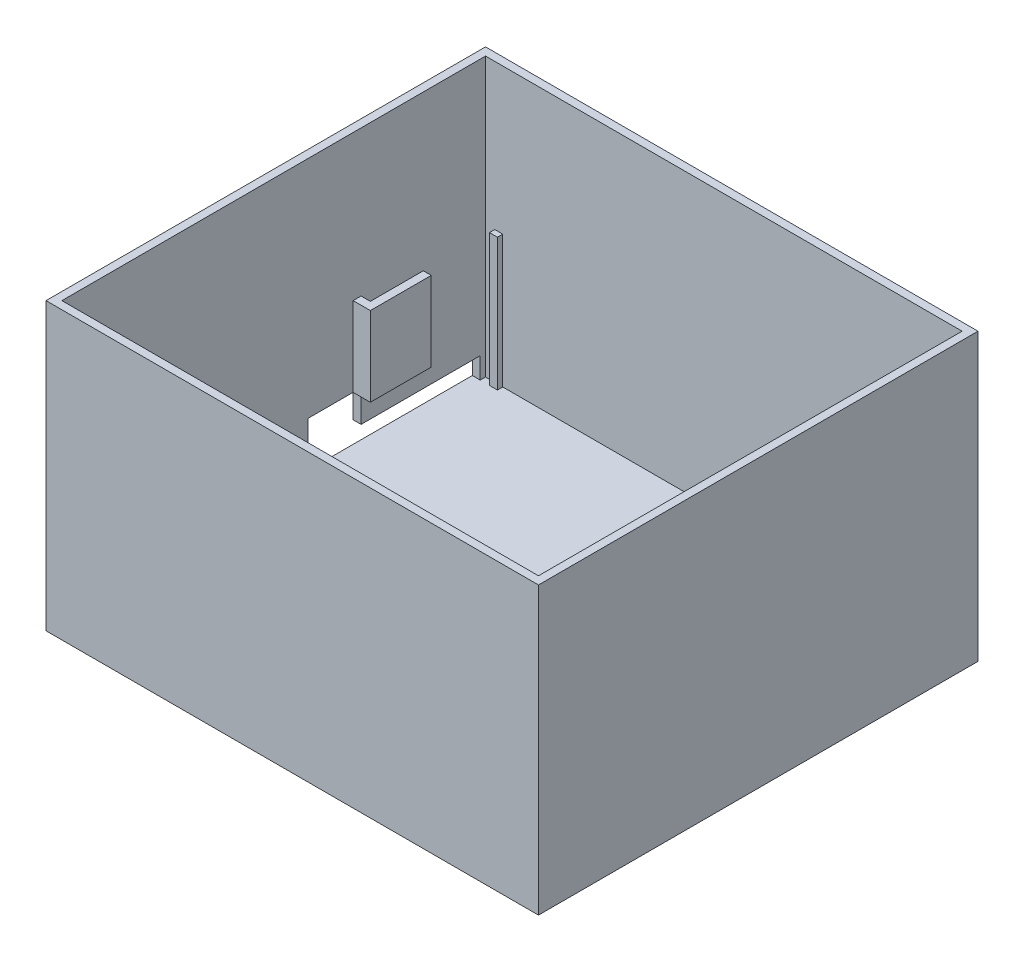
ISO-10303-21;
HEADER;
FILE_DESCRIPTION(('STEP AP214'),'2;1');
FILE_NAME('part.step','',(''),(''),'','','');
FILE_SCHEMA(('AUTOMOTIVE_DESIGN { 1 0 10303 214 1 1 1 1 }'));
ENDSEC;
DATA;
#1=APPLICATION_CONTEXT('core data for automotive mechanical design processes');
#2=APPLICATION_PROTOCOL_DEFINITION('international standard','automotive_design',2000,#1);
#3=PRODUCT_CONTEXT('',#1,'mechanical');
#4=PRODUCT('Part','Part','',(#3));
#5=PRODUCT_RELATED_PRODUCT_CATEGORY('part','',(#4));
#6=PRODUCT_DEFINITION_FORMATION('','',#4);
#7=PRODUCT_DEFINITION_CONTEXT('part definition',#1,'design');
#8=PRODUCT_DEFINITION('design','',#6,#7);
#9=PRODUCT_DEFINITION_SHAPE('','',#8);
#10=(LENGTH_UNIT() NAMED_UNIT(*) SI_UNIT(.MILLI.,.METRE.));
#11=(NAMED_UNIT(*) PLANE_ANGLE_UNIT() SI_UNIT($,.RADIAN.));
#12=(NAMED_UNIT(*) SI_UNIT($,.STERADIAN.) SOLID_ANGLE_UNIT());
#13=UNCERTAINTY_MEASURE_WITH_UNIT(LENGTH_MEASURE(1.E-05),#10,'distance_accuracy_value','');
#14=(GEOMETRIC_REPRESENTATION_CONTEXT(3) GLOBAL_UNCERTAINTY_ASSIGNED_CONTEXT((#13)) GLOBAL_UNIT_ASSIGNED_CONTEXT((#10,
#11,#12)) REPRESENTATION_CONTEXT('',''));
#15=CARTESIAN_POINT('',(0.,0.,0.));
#16=DIRECTION('',(0.,0.,1.));
#17=DIRECTION('',(1.,0.,0.));
#18=AXIS2_PLACEMENT_3D('',#15,#16,#17);
#19=CARTESIAN_POINT('',(-79.75,23.,-2.875));
#20=DIRECTION('',(0.,0.,1.));
#21=DIRECTION('',(1.,0.,0.));
#22=AXIS2_PLACEMENT_3D('',#19,#20,#21);
#23=PLANE('',#22);
#24=DIRECTION('',(0.,1.,0.));
#25=VECTOR('',#24,1.);
#26=CARTESIAN_POINT('',(-82.75,23.,-2.875));
#27=LINE('',#26,#25);
#28=CARTESIAN_POINT('',(-82.75,23.,-2.875));
#29=VERTEX_POINT('',#28);
#30=CARTESIAN_POINT('',(-82.75,53.,-2.875));
#31=VERTEX_POINT('',#30);
#32=EDGE_CURVE('E242',#29,#31,#27,.T.);
#33=ORIENTED_EDGE('',*,*,#32,.F.);
#34=DIRECTION('',(-1.,0.,0.));
#35=VECTOR('',#34,1.);
#36=CARTESIAN_POINT('',(-79.75,23.,-2.875));
#37=LINE('',#36,#35);
#38=CARTESIAN_POINT('',(-86.25,23.,-2.875));
#39=VERTEX_POINT('',#38);
#40=EDGE_CURVE('E265',#29,#39,#37,.T.);
#41=ORIENTED_EDGE('',*,*,#40,.T.);
#42=DIRECTION('',(0.,1.,0.));
#43=VECTOR('',#42,1.);
#44=CARTESIAN_POINT('',(-86.25,23.,-2.875));
#45=LINE('',#44,#43);
#46=CARTESIAN_POINT('',(-86.25,53.,-2.875));
#47=VERTEX_POINT('',#46);
#48=EDGE_CURVE('E247',#39,#47,#45,.T.);
#49=ORIENTED_EDGE('',*,*,#48,.T.);
#50=DIRECTION('',(-1.,0.,0.));
#51=VECTOR('',#50,1.);
#52=CARTESIAN_POINT('',(-79.75,53.,-2.875));
#53=LINE('',#52,#51);
#54=EDGE_CURVE('E55',#31,#47,#53,.T.);
#55=ORIENTED_EDGE('',*,*,#54,.F.);
#56=EDGE_LOOP('',(#33,#41,#49,#55));
#57=FACE_BOUND('',#56,.T.);
#58=ADVANCED_FACE('F39',(#57),#23,.F.);
#59=CARTESIAN_POINT('',(-86.25,108.,-49.875));
#60=DIRECTION('',(-1.,0.,0.));
#61=DIRECTION('',(0.,0.,1.));
#62=AXIS2_PLACEMENT_3D('',#59,#60,#61);
#63=PLANE('',#62);
#64=ORIENTED_EDGE('',*,*,#48,.F.);
#65=DIRECTION('',(0.,-1.,0.));
#66=VECTOR('',#65,1.);
#67=CARTESIAN_POINT('',(-86.25,2.99999999999999,-2.875));
#68=LINE('',#67,#66);
#69=CARTESIAN_POINT('',(-86.25,11.,-2.875));
#70=VERTEX_POINT('',#69);
#71=EDGE_CURVE('E284',#39,#70,#68,.T.);
#72=ORIENTED_EDGE('',*,*,#71,.T.);
#73=DIRECTION('',(0.,0.,1.));
#74=VECTOR('',#73,1.);
#75=CARTESIAN_POINT('',(-86.25,11.,-47.875));
#76=LINE('',#75,#74);
#77=CARTESIAN_POINT('',(-86.25,11.,-47.875));
#78=VERTEX_POINT('',#77);
#79=EDGE_CURVE('E359',#78,#70,#76,.T.);
#80=ORIENTED_EDGE('',*,*,#79,.F.);
#81=DIRECTION('',(0.,1.,0.));
#82=VECTOR('',#81,1.);
#83=CARTESIAN_POINT('',(-86.25,3.,-47.875));
#84=LINE('',#83,#82);
#85=CARTESIAN_POINT('',(-86.25,3.,-47.875));
#86=VERTEX_POINT('',#85);
#87=EDGE_CURVE('E353',#86,#78,#84,.T.);
#88=ORIENTED_EDGE('',*,*,#87,.F.);
#89=DIRECTION('',(0.,0.,-1.));
#90=VECTOR('',#89,1.);
#91=CARTESIAN_POINT('',(-86.25,3.,-49.875));
#92=LINE('',#91,#90);
#93=CARTESIAN_POINT('',(-86.25,3.,-49.875));
#94=VERTEX_POINT('',#93);
#95=EDGE_CURVE('E416',#86,#94,#92,.T.);
#96=ORIENTED_EDGE('',*,*,#95,.T.);
#97=DIRECTION('',(0.,-1.,0.));
#98=VECTOR('',#97,1.);
#99=CARTESIAN_POINT('',(-86.25,108.,-49.875));
#100=LINE('',#99,#98);
#101=CARTESIAN_POINT('',(-86.25,108.,-49.875));
#102=VERTEX_POINT('',#101);
#103=EDGE_CURVE('E421',#102,#94,#100,.T.);
#104=ORIENTED_EDGE('',*,*,#103,.F.);
#105=DIRECTION('',(0.,0.,-1.));
#106=VECTOR('',#105,1.);
#107=CARTESIAN_POINT('',(-86.25,108.,-49.875));
#108=LINE('',#107,#106);
#109=CARTESIAN_POINT('',(-86.25,108.,110.125));
#110=VERTEX_POINT('',#109);
#111=EDGE_CURVE('E417',#110,#102,#108,.T.);
#112=ORIENTED_EDGE('',*,*,#111,.F.);
#113=DIRECTION('',(0.,-1.,0.));
#114=VECTOR('',#113,1.);
#115=CARTESIAN_POINT('',(-86.25,108.,110.125));
#116=LINE('',#115,#114);
#117=CARTESIAN_POINT('',(-86.25,3.,110.125));
#118=VERTEX_POINT('',#117);
#119=EDGE_CURVE('E430',#110,#118,#116,.T.);
#120=ORIENTED_EDGE('',*,*,#119,.T.);
#121=CARTESIAN_POINT('',(-86.25,3.,54.125));
#122=VERTEX_POINT('',#121);
#123=EDGE_CURVE('E422',#118,#122,#92,.T.);
#124=ORIENTED_EDGE('',*,*,#123,.T.);
#125=DIRECTION('',(0.,-1.,0.));
#126=VECTOR('',#125,1.);
#127=CARTESIAN_POINT('',(-86.25,23.,54.125));
#128=LINE('',#127,#126);
#129=CARTESIAN_POINT('',(-86.25,23.,54.125));
#130=VERTEX_POINT('',#129);
#131=EDGE_CURVE('E413',#130,#122,#128,.T.);
#132=ORIENTED_EDGE('',*,*,#131,.F.);
#133=DIRECTION('',(0.,0.,1.));
#134=VECTOR('',#133,1.);
#135=CARTESIAN_POINT('',(-86.25,23.,51.125));
#136=LINE('',#135,#134);
#137=CARTESIAN_POINT('',(-86.25,23.,51.125));
#138=VERTEX_POINT('',#137);
#139=EDGE_CURVE('E383',#138,#130,#136,.T.);
#140=ORIENTED_EDGE('',*,*,#139,.F.);
#141=DIRECTION('',(0.,-1.,0.));
#142=VECTOR('',#141,1.);
#143=CARTESIAN_POINT('',(-86.25,23.,51.125));
#144=LINE('',#143,#142);
#145=CARTESIAN_POINT('',(-86.25,3.,51.125));
#146=VERTEX_POINT('',#145);
#147=EDGE_CURVE('E398',#138,#146,#144,.T.);
#148=ORIENTED_EDGE('',*,*,#147,.T.);
#149=CARTESIAN_POINT('',(-86.25,2.99999999999999,17.125));
#150=VERTEX_POINT('',#149);
#151=EDGE_CURVE('E426',#146,#150,#92,.T.);
#152=ORIENTED_EDGE('',*,*,#151,.T.);
#153=DIRECTION('',(0.,1.,0.));
#154=VECTOR('',#153,1.);
#155=CARTESIAN_POINT('',(-86.25,2.99999999999999,17.125));
#156=LINE('',#155,#154);
#157=CARTESIAN_POINT('',(-86.25,23.,17.125));
#158=VERTEX_POINT('',#157);
#159=EDGE_CURVE('E288',#150,#158,#156,.T.);
#160=ORIENTED_EDGE('',*,*,#159,.T.);
#161=DIRECTION('',(0.,0.,-1.));
#162=VECTOR('',#161,1.);
#163=CARTESIAN_POINT('',(-86.25,23.,-2.875));
#164=LINE('',#163,#162);
#165=CARTESIAN_POINT('',(-86.25,23.,0.124999999999998));
#166=VERTEX_POINT('',#165);
#167=EDGE_CURVE('E293',#158,#166,#164,.T.);
#168=ORIENTED_EDGE('',*,*,#167,.T.);
#169=DIRECTION('',(0.,-1.,0.));
#170=VECTOR('',#169,1.);
#171=CARTESIAN_POINT('',(-86.25,23.,0.124999999999998));
#172=LINE('',#171,#170);
#173=CARTESIAN_POINT('',(-86.25,53.,0.125));
#174=VERTEX_POINT('',#173);
#175=EDGE_CURVE('E62',#174,#166,#172,.T.);
#176=ORIENTED_EDGE('',*,*,#175,.F.);
#177=DIRECTION('',(0.,0.,1.));
#178=VECTOR('',#177,1.);
#179=CARTESIAN_POINT('',(-86.25,53.,-2.875));
#180=LINE('',#179,#178);
#181=EDGE_CURVE('E253',#47,#174,#180,.T.);
#182=ORIENTED_EDGE('',*,*,#181,.F.);
#183=EDGE_LOOP('',(#64,#72,#80,#88,#96,#104,#112,#120,#124,#132,#140,#148,#152,#160,#168,#176,#182));
#184=FACE_BOUND('',#183,.T.);
#185=ADVANCED_FACE('F530',(#184),#63,.F.);
#186=CARTESIAN_POINT('',(0.,3.,0.));
#187=DIRECTION('',(0.,1.,0.));
#188=DIRECTION('',(0.,0.,1.));
#189=AXIS2_PLACEMENT_3D('',#186,#187,#188);
#190=PLANE('',#189);
#191=DIRECTION('',(-1.,0.,0.));
#192=VECTOR('',#191,1.);
#193=CARTESIAN_POINT('',(-86.25,2.99999999999999,17.125));
#194=LINE('',#193,#192);
#195=CARTESIAN_POINT('',(-89.25,2.99999999999999,17.125));
#196=VERTEX_POINT('',#195);
#197=EDGE_CURVE('E296',#150,#196,#194,.T.);
#198=ORIENTED_EDGE('',*,*,#197,.F.);
#199=ORIENTED_EDGE('',*,*,#151,.F.);
#200=DIRECTION('',(-1.,0.,0.));
#201=VECTOR('',#200,1.);
#202=CARTESIAN_POINT('',(-86.25,3.,51.125));
#203=LINE('',#202,#201);
#204=CARTESIAN_POINT('',(93.7499999999999,3.,51.125));
#205=VERTEX_POINT('',#204);
#206=EDGE_CURVE('E388',#205,#146,#203,.T.);
#207=ORIENTED_EDGE('',*,*,#206,.F.);
#208=DIRECTION('',(0.,0.,1.));
#209=VECTOR('',#208,1.);
#210=CARTESIAN_POINT('',(93.75,3.,-49.875));
#211=LINE('',#210,#209);
#212=CARTESIAN_POINT('',(93.7499999999999,3.,-49.875));
#213=VERTEX_POINT('',#212);
#214=EDGE_CURVE('E451',#213,#205,#211,.T.);
#215=ORIENTED_EDGE('',*,*,#214,.F.);
#216=DIRECTION('',(1.,0.,0.));
#217=VECTOR('',#216,1.);
#218=CARTESIAN_POINT('',(-89.25,3.,-49.875));
#219=LINE('',#218,#217);
#220=CARTESIAN_POINT('',(-79.75,3.,-49.875));
#221=VERTEX_POINT('',#220);
#222=EDGE_CURVE('E433',#221,#213,#219,.T.);
#223=ORIENTED_EDGE('',*,*,#222,.F.);
#224=DIRECTION('',(0.,0.,-1.));
#225=VECTOR('',#224,1.);
#226=CARTESIAN_POINT('',(-79.75,3.,-49.875));
#227=LINE('',#226,#225);
#228=CARTESIAN_POINT('',(-79.75,3.,-47.875));
#229=VERTEX_POINT('',#228);
#230=EDGE_CURVE('E321',#229,#221,#227,.T.);
#231=ORIENTED_EDGE('',*,*,#230,.F.);
#232=DIRECTION('',(1.,0.,0.));
#233=VECTOR('',#232,1.);
#234=CARTESIAN_POINT('',(-82.75,3.,-47.875));
#235=LINE('',#234,#233);
#236=CARTESIAN_POINT('',(-82.75,3.,-47.875));
#237=VERTEX_POINT('',#236);
#238=EDGE_CURVE('E335',#237,#229,#235,.T.);
#239=ORIENTED_EDGE('',*,*,#238,.F.);
#240=DIRECTION('',(0.,0.,1.));
#241=VECTOR('',#240,1.);
#242=CARTESIAN_POINT('',(-82.75,3.,-49.875));
#243=LINE('',#242,#241);
#244=CARTESIAN_POINT('',(-82.75,3.,-49.875));
#245=VERTEX_POINT('',#244);
#246=EDGE_CURVE('E309',#245,#237,#243,.T.);
#247=ORIENTED_EDGE('',*,*,#246,.F.);
#248=EDGE_CURVE('E438',#94,#245,#219,.T.);
#249=ORIENTED_EDGE('',*,*,#248,.F.);
#250=ORIENTED_EDGE('',*,*,#95,.F.);
#251=DIRECTION('',(1.,0.,0.));
#252=VECTOR('',#251,1.);
#253=CARTESIAN_POINT('',(-89.25,3.,-47.875));
#254=LINE('',#253,#252);
#255=CARTESIAN_POINT('',(-89.25,3.,-47.875));
#256=VERTEX_POINT('',#255);
#257=EDGE_CURVE('E373',#256,#86,#254,.T.);
#258=ORIENTED_EDGE('',*,*,#257,.F.);
#259=DIRECTION('',(0.,0.,-1.));
#260=VECTOR('',#259,1.);
#261=CARTESIAN_POINT('',(-89.25,3.,-47.875));
#262=LINE('',#261,#260);
#263=EDGE_CURVE('E363',#196,#256,#262,.T.);
#264=ORIENTED_EDGE('',*,*,#263,.F.);
#265=EDGE_LOOP('',(#198,#199,#207,#215,#223,#231,#239,#247,#249,#250,#258,#264));
#266=FACE_BOUND('',#265,.T.);
#267=ADVANCED_FACE('F536',(#266),#190,.T.);
#268=CARTESIAN_POINT('',(-89.25,108.,-49.875));
#269=DIRECTION('',(0.,0.,-1.));
#270=DIRECTION('',(-1.,0.,0.));
#271=AXIS2_PLACEMENT_3D('',#268,#269,#270);
#272=PLANE('',#271);
#273=DIRECTION('',(0.,-1.,0.));
#274=VECTOR('',#273,1.);
#275=CARTESIAN_POINT('',(-82.75,53.,-49.875));
#276=LINE('',#275,#274);
#277=CARTESIAN_POINT('',(-82.75,53.,-49.875));
#278=VERTEX_POINT('',#277);
#279=EDGE_CURVE('E331',#278,#245,#276,.T.);
#280=ORIENTED_EDGE('',*,*,#279,.F.);
#281=DIRECTION('',(-1.,0.,0.));
#282=VECTOR('',#281,1.);
#283=CARTESIAN_POINT('',(-82.75,53.,-49.875));
#284=LINE('',#283,#282);
#285=CARTESIAN_POINT('',(-79.75,53.,-49.875));
#286=VERTEX_POINT('',#285);
#287=EDGE_CURVE('E328',#286,#278,#284,.T.);
#288=ORIENTED_EDGE('',*,*,#287,.F.);
#289=DIRECTION('',(0.,-1.,0.));
#290=VECTOR('',#289,1.);
#291=CARTESIAN_POINT('',(-79.75,53.,-49.875));
#292=LINE('',#291,#290);
#293=EDGE_CURVE('E342',#286,#221,#292,.T.);
#294=ORIENTED_EDGE('',*,*,#293,.T.);
#295=ORIENTED_EDGE('',*,*,#222,.T.);
#296=DIRECTION('',(0.,-1.,0.));
#297=VECTOR('',#296,1.);
#298=CARTESIAN_POINT('',(93.75,108.,-49.875));
#299=LINE('',#298,#297);
#300=CARTESIAN_POINT('',(93.75,108.,-49.875));
#301=VERTEX_POINT('',#300);
#302=EDGE_CURVE('E454',#301,#213,#299,.T.);
#303=ORIENTED_EDGE('',*,*,#302,.F.);
#304=DIRECTION('',(1.,0.,0.));
#305=VECTOR('',#304,1.);
#306=CARTESIAN_POINT('',(-89.25,108.,-49.875));
#307=LINE('',#306,#305);
#308=EDGE_CURVE('E434',#102,#301,#307,.T.);
#309=ORIENTED_EDGE('',*,*,#308,.F.);
#310=ORIENTED_EDGE('',*,*,#103,.T.);
#311=ORIENTED_EDGE('',*,*,#248,.T.);
#312=EDGE_LOOP('',(#280,#288,#294,#295,#303,#309,#310,#311));
#313=FACE_BOUND('',#312,.T.);
#314=ADVANCED_FACE('F589',(#313),#272,.F.);
#315=CARTESIAN_POINT('',(93.7499999999999,3.,54.125));
#316=VERTEX_POINT('',#315);
#317=CARTESIAN_POINT('',(93.75,3.,110.125));
#318=VERTEX_POINT('',#317);
#319=EDGE_CURVE('E442',#316,#318,#211,.T.);
#320=ORIENTED_EDGE('',*,*,#319,.F.);
#321=DIRECTION('',(1.,0.,0.));
#322=VECTOR('',#321,1.);
#323=CARTESIAN_POINT('',(-86.25,3.,54.125));
#324=LINE('',#323,#322);
#325=EDGE_CURVE('E376',#122,#316,#324,.T.);
#326=ORIENTED_EDGE('',*,*,#325,.F.);
#327=ORIENTED_EDGE('',*,*,#123,.F.);
#328=DIRECTION('',(-1.,0.,0.));
#329=VECTOR('',#328,1.);
#330=CARTESIAN_POINT('',(-89.25,3.,110.125));
#331=LINE('',#330,#329);
#332=EDGE_CURVE('E461',#318,#118,#331,.T.);
#333=ORIENTED_EDGE('',*,*,#332,.F.);
#334=EDGE_LOOP('',(#320,#326,#327,#333));
#335=FACE_BOUND('',#334,.T.);
#336=ADVANCED_FACE('F592',(#335),#190,.T.);
#337=CARTESIAN_POINT('',(93.75,108.,-49.875));
#338=DIRECTION('',(1.,0.,0.));
#339=DIRECTION('',(0.,0.,-1.));
#340=AXIS2_PLACEMENT_3D('',#337,#338,#339);
#341=PLANE('',#340);
#342=DIRECTION('',(0.,-1.,0.));
#343=VECTOR('',#342,1.);
#344=CARTESIAN_POINT('',(93.7499999999999,23.,54.125));
#345=LINE('',#344,#343);
#346=CARTESIAN_POINT('',(93.7499999999999,23.,54.125));
#347=VERTEX_POINT('',#346);
#348=EDGE_CURVE('E409',#347,#316,#345,.T.);
#349=ORIENTED_EDGE('',*,*,#348,.T.);
#350=ORIENTED_EDGE('',*,*,#319,.T.);
#351=DIRECTION('',(0.,-1.,0.));
#352=VECTOR('',#351,1.);
#353=CARTESIAN_POINT('',(93.75,108.,110.125));
#354=LINE('',#353,#352);
#355=CARTESIAN_POINT('',(93.75,108.,110.125));
#356=VERTEX_POINT('',#355);
#357=EDGE_CURVE('E474',#356,#318,#354,.T.);
#358=ORIENTED_EDGE('',*,*,#357,.F.);
#359=DIRECTION('',(0.,0.,1.));
#360=VECTOR('',#359,1.);
#361=CARTESIAN_POINT('',(93.75,108.,-49.875));
#362=LINE('',#361,#360);
#363=EDGE_CURVE('E450',#301,#356,#362,.T.);
#364=ORIENTED_EDGE('',*,*,#363,.F.);
#365=ORIENTED_EDGE('',*,*,#302,.T.);
#366=ORIENTED_EDGE('',*,*,#214,.T.);
#367=DIRECTION('',(0.,-1.,0.));
#368=VECTOR('',#367,1.);
#369=CARTESIAN_POINT('',(93.7499999999999,23.,51.125));
#370=LINE('',#369,#368);
#371=CARTESIAN_POINT('',(93.7499999999999,23.,51.125));
#372=VERTEX_POINT('',#371);
#373=EDGE_CURVE('E406',#372,#205,#370,.T.);
#374=ORIENTED_EDGE('',*,*,#373,.F.);
#375=DIRECTION('',(0.,0.,-1.));
#376=VECTOR('',#375,1.);
#377=CARTESIAN_POINT('',(93.7499999999999,23.,51.125));
#378=LINE('',#377,#376);
#379=EDGE_CURVE('E391',#347,#372,#378,.T.);
#380=ORIENTED_EDGE('',*,*,#379,.F.);
#381=EDGE_LOOP('',(#349,#350,#358,#364,#365,#366,#374,#380));
#382=FACE_BOUND('',#381,.T.);
#383=ADVANCED_FACE('F594',(#382),#341,.F.);
#384=CARTESIAN_POINT('',(-89.25,108.,110.125));
#385=DIRECTION('',(0.,0.,1.));
#386=DIRECTION('',(1.,0.,0.));
#387=AXIS2_PLACEMENT_3D('',#384,#385,#386);
#388=PLANE('',#387);
#389=ORIENTED_EDGE('',*,*,#119,.F.);
#390=DIRECTION('',(-1.,0.,0.));
#391=VECTOR('',#390,1.);
#392=CARTESIAN_POINT('',(-89.25,108.,110.125));
#393=LINE('',#392,#391);
#394=EDGE_CURVE('E470',#356,#110,#393,.T.);
#395=ORIENTED_EDGE('',*,*,#394,.F.);
#396=ORIENTED_EDGE('',*,*,#357,.T.);
#397=ORIENTED_EDGE('',*,*,#332,.T.);
#398=EDGE_LOOP('',(#389,#395,#396,#397));
#399=FACE_BOUND('',#398,.T.);
#400=ADVANCED_FACE('F527',(#399),#388,.F.);
#401=CARTESIAN_POINT('',(-89.25,3.,-52.875));
#402=DIRECTION('',(1.,0.,0.));
#403=DIRECTION('',(0.,0.,-1.));
#404=AXIS2_PLACEMENT_3D('',#401,#402,#403);
#405=PLANE('',#404);
#406=DIRECTION('',(0.,0.,1.));
#407=VECTOR('',#406,1.);
#408=CARTESIAN_POINT('',(-89.25,11.,-47.875));
#409=LINE('',#408,#407);
#410=CARTESIAN_POINT('',(-89.25,11.,-47.875));
#411=VERTEX_POINT('',#410);
#412=CARTESIAN_POINT('',(-89.25,11.,-2.875));
#413=VERTEX_POINT('',#412);
#414=EDGE_CURVE('E358',#411,#413,#409,.T.);
#415=ORIENTED_EDGE('',*,*,#414,.T.);
#416=DIRECTION('',(0.,-1.,0.));
#417=VECTOR('',#416,1.);
#418=CARTESIAN_POINT('',(-89.25,2.99999999999999,-2.875));
#419=LINE('',#418,#417);
#420=CARTESIAN_POINT('',(-89.25,23.,-2.875));
#421=VERTEX_POINT('',#420);
#422=EDGE_CURVE('E283',#421,#413,#419,.T.);
#423=ORIENTED_EDGE('',*,*,#422,.F.);
#424=DIRECTION('',(0.,0.,-1.));
#425=VECTOR('',#424,1.);
#426=CARTESIAN_POINT('',(-89.25,23.,-2.875));
#427=LINE('',#426,#425);
#428=CARTESIAN_POINT('',(-89.25,23.,17.125));
#429=VERTEX_POINT('',#428);
#430=EDGE_CURVE('E289',#429,#421,#427,.T.);
#431=ORIENTED_EDGE('',*,*,#430,.F.);
#432=DIRECTION('',(0.,1.,0.));
#433=VECTOR('',#432,1.);
#434=CARTESIAN_POINT('',(-89.25,2.99999999999999,17.125));
#435=LINE('',#434,#433);
#436=EDGE_CURVE('E299',#196,#429,#435,.T.);
#437=ORIENTED_EDGE('',*,*,#436,.F.);
#438=ORIENTED_EDGE('',*,*,#263,.T.);
#439=DIRECTION('',(0.,1.,0.));
#440=VECTOR('',#439,1.);
#441=CARTESIAN_POINT('',(-89.25,3.,-47.875));
#442=LINE('',#441,#440);
#443=EDGE_CURVE('E354',#256,#411,#442,.T.);
#444=ORIENTED_EDGE('',*,*,#443,.T.);
#445=EDGE_LOOP('',(#415,#423,#431,#437,#438,#444));
#446=FACE_BOUND('',#445,.T.);
#447=DIRECTION('',(0.,0.,1.));
#448=VECTOR('',#447,1.);
#449=CARTESIAN_POINT('',(-89.25,0.,-52.875));
#450=LINE('',#449,#448);
#451=CARTESIAN_POINT('',(-89.25,0.,-52.875));
#452=VERTEX_POINT('',#451);
#453=CARTESIAN_POINT('',(-89.25,0.,113.125));
#454=VERTEX_POINT('',#453);
#455=EDGE_CURVE('E481',#452,#454,#450,.T.);
#456=ORIENTED_EDGE('',*,*,#455,.T.);
#457=DIRECTION('',(0.,-1.,0.));
#458=VECTOR('',#457,1.);
#459=CARTESIAN_POINT('',(-89.25,3.,113.125));
#460=LINE('',#459,#458);
#461=CARTESIAN_POINT('',(-89.25,108.,113.125));
#462=VERTEX_POINT('',#461);
#463=EDGE_CURVE('E11',#462,#454,#460,.T.);
#464=ORIENTED_EDGE('',*,*,#463,.F.);
#465=DIRECTION('',(0.,0.,1.));
#466=VECTOR('',#465,1.);
#467=CARTESIAN_POINT('',(-89.25,108.,110.125));
#468=LINE('',#467,#466);
#469=CARTESIAN_POINT('',(-89.25,108.,-52.875));
#470=VERTEX_POINT('',#469);
#471=EDGE_CURVE('E462',#470,#462,#468,.T.);
#472=ORIENTED_EDGE('',*,*,#471,.F.);
#473=DIRECTION('',(0.,-1.,0.));
#474=VECTOR('',#473,1.);
#475=CARTESIAN_POINT('',(-89.25,3.,-52.875));
#476=LINE('',#475,#474);
#477=EDGE_CURVE('E494',#470,#452,#476,.T.);
#478=ORIENTED_EDGE('',*,*,#477,.T.);
#479=EDGE_LOOP('',(#456,#464,#472,#478));
#480=FACE_BOUND('',#479,.T.);
#481=ADVANCED_FACE('F41',(#446,#480),#405,.F.);
#482=CARTESIAN_POINT('',(-89.25,3.,113.125));
#483=DIRECTION('',(0.,0.,-1.));
#484=DIRECTION('',(-1.,0.,0.));
#485=AXIS2_PLACEMENT_3D('',#482,#483,#484);
#486=PLANE('',#485);
#487=DIRECTION('',(0.,-1.,0.));
#488=VECTOR('',#487,1.);
#489=CARTESIAN_POINT('',(96.75,3.,113.125));
#490=LINE('',#489,#488);
#491=CARTESIAN_POINT('',(96.75,108.,113.125));
#492=VERTEX_POINT('',#491);
#493=CARTESIAN_POINT('',(96.75,0.,113.125));
#494=VERTEX_POINT('',#493);
#495=EDGE_CURVE('E48',#492,#494,#490,.T.);
#496=ORIENTED_EDGE('',*,*,#495,.F.);
#497=DIRECTION('',(1.,0.,0.));
#498=VECTOR('',#497,1.);
#499=CARTESIAN_POINT('',(-89.25,108.,113.125));
#500=LINE('',#499,#498);
#501=EDGE_CURVE('E466',#462,#492,#500,.T.);
#502=ORIENTED_EDGE('',*,*,#501,.F.);
#503=ORIENTED_EDGE('',*,*,#463,.T.);
#504=DIRECTION('',(1.,0.,0.));
#505=VECTOR('',#504,1.);
#506=CARTESIAN_POINT('',(-89.25,0.,113.125));
#507=LINE('',#506,#505);
#508=EDGE_CURVE('E485',#454,#494,#507,.T.);
#509=ORIENTED_EDGE('',*,*,#508,.T.);
#510=EDGE_LOOP('',(#496,#502,#503,#509));
#511=FACE_BOUND('',#510,.T.);
#512=ADVANCED_FACE('F520',(#511),#486,.F.);
#513=CARTESIAN_POINT('',(96.75,3.,-52.875));
#514=DIRECTION('',(-1.,0.,0.));
#515=DIRECTION('',(0.,0.,1.));
#516=AXIS2_PLACEMENT_3D('',#513,#514,#515);
#517=PLANE('',#516);
#518=DIRECTION('',(0.,-1.,0.));
#519=VECTOR('',#518,1.);
#520=CARTESIAN_POINT('',(96.75,3.,-52.875));
#521=LINE('',#520,#519);
#522=CARTESIAN_POINT('',(96.75,108.,-52.875));
#523=VERTEX_POINT('',#522);
#524=CARTESIAN_POINT('',(96.75,0.,-52.875));
#525=VERTEX_POINT('',#524);
#526=EDGE_CURVE('E498',#523,#525,#521,.T.);
#527=ORIENTED_EDGE('',*,*,#526,.F.);
#528=DIRECTION('',(0.,0.,-1.));
#529=VECTOR('',#528,1.);
#530=CARTESIAN_POINT('',(96.75,108.,-49.875));
#531=LINE('',#530,#529);
#532=EDGE_CURVE('E446',#492,#523,#531,.T.);
#533=ORIENTED_EDGE('',*,*,#532,.F.);
#534=ORIENTED_EDGE('',*,*,#495,.T.);
#535=DIRECTION('',(0.,0.,-1.));
#536=VECTOR('',#535,1.);
#537=CARTESIAN_POINT('',(96.75,0.,-52.875));
#538=LINE('',#537,#536);
#539=EDGE_CURVE('E488',#494,#525,#538,.T.);
#540=ORIENTED_EDGE('',*,*,#539,.T.);
#541=EDGE_LOOP('',(#527,#533,#534,#540));
#542=FACE_BOUND('',#541,.T.);
#543=ADVANCED_FACE('F506',(#542),#517,.F.);
#544=CARTESIAN_POINT('',(-89.25,3.,-52.875));
#545=DIRECTION('',(0.,0.,1.));
#546=DIRECTION('',(1.,0.,0.));
#547=AXIS2_PLACEMENT_3D('',#544,#545,#546);
#548=PLANE('',#547);
#549=DIRECTION('',(-1.,0.,0.));
#550=VECTOR('',#549,1.);
#551=CARTESIAN_POINT('',(-89.25,0.,-52.875));
#552=LINE('',#551,#550);
#553=EDGE_CURVE('E491',#525,#452,#552,.T.);
#554=ORIENTED_EDGE('',*,*,#553,.T.);
#555=ORIENTED_EDGE('',*,*,#477,.F.);
#556=DIRECTION('',(-1.,0.,0.));
#557=VECTOR('',#556,1.);
#558=CARTESIAN_POINT('',(-89.25,108.,-52.875));
#559=LINE('',#558,#557);
#560=EDGE_CURVE('E437',#523,#470,#559,.T.);
#561=ORIENTED_EDGE('',*,*,#560,.F.);
#562=ORIENTED_EDGE('',*,*,#526,.T.);
#563=EDGE_LOOP('',(#554,#555,#561,#562));
#564=FACE_BOUND('',#563,.T.);
#565=ADVANCED_FACE('F515',(#564),#548,.F.);
#566=CARTESIAN_POINT('',(0.,0.,0.));
#567=DIRECTION('',(0.,1.,0.));
#568=DIRECTION('',(0.,0.,1.));
#569=AXIS2_PLACEMENT_3D('',#566,#567,#568);
#570=PLANE('',#569);
#571=ORIENTED_EDGE('',*,*,#455,.F.);
#572=ORIENTED_EDGE('',*,*,#553,.F.);
#573=ORIENTED_EDGE('',*,*,#539,.F.);
#574=ORIENTED_EDGE('',*,*,#508,.F.);
#575=EDGE_LOOP('',(#571,#572,#573,#574));
#576=FACE_BOUND('',#575,.T.);
#577=ADVANCED_FACE('F512',(#576),#570,.F.);
#578=CARTESIAN_POINT('',(0.,108.,0.));
#579=DIRECTION('',(0.,1.,0.));
#580=DIRECTION('',(0.,0.,1.));
#581=AXIS2_PLACEMENT_3D('',#578,#579,#580);
#582=PLANE('',#581);
#583=ORIENTED_EDGE('',*,*,#394,.T.);
#584=ORIENTED_EDGE('',*,*,#111,.T.);
#585=ORIENTED_EDGE('',*,*,#308,.T.);
#586=ORIENTED_EDGE('',*,*,#363,.T.);
#587=EDGE_LOOP('',(#583,#584,#585,#586));
#588=FACE_BOUND('',#587,.T.);
#589=ORIENTED_EDGE('',*,*,#471,.T.);
#590=ORIENTED_EDGE('',*,*,#501,.T.);
#591=ORIENTED_EDGE('',*,*,#532,.T.);
#592=ORIENTED_EDGE('',*,*,#560,.T.);
#593=EDGE_LOOP('',(#589,#590,#591,#592));
#594=FACE_BOUND('',#593,.T.);
#595=ADVANCED_FACE('F519',(#588,#594),#582,.T.);
#596=CARTESIAN_POINT('',(-86.25,23.,54.125));
#597=DIRECTION('',(0.,0.,-1.));
#598=DIRECTION('',(-1.,0.,0.));
#599=AXIS2_PLACEMENT_3D('',#596,#597,#598);
#600=PLANE('',#599);
#601=ORIENTED_EDGE('',*,*,#325,.T.);
#602=ORIENTED_EDGE('',*,*,#348,.F.);
#603=DIRECTION('',(1.,0.,0.));
#604=VECTOR('',#603,1.);
#605=CARTESIAN_POINT('',(-86.25,23.,54.125));
#606=LINE('',#605,#604);
#607=EDGE_CURVE('E387',#130,#347,#606,.T.);
#608=ORIENTED_EDGE('',*,*,#607,.F.);
#609=ORIENTED_EDGE('',*,*,#131,.T.);
#610=EDGE_LOOP('',(#601,#602,#608,#609));
#611=FACE_BOUND('',#610,.T.);
#612=ADVANCED_FACE('F584',(#611),#600,.F.);
#613=CARTESIAN_POINT('',(-86.25,23.,51.125));
#614=DIRECTION('',(0.,0.,1.));
#615=DIRECTION('',(1.,0.,0.));
#616=AXIS2_PLACEMENT_3D('',#613,#614,#615);
#617=PLANE('',#616);
#618=ORIENTED_EDGE('',*,*,#206,.T.);
#619=ORIENTED_EDGE('',*,*,#147,.F.);
#620=DIRECTION('',(-1.,0.,0.));
#621=VECTOR('',#620,1.);
#622=CARTESIAN_POINT('',(-86.25,23.,51.125));
#623=LINE('',#622,#621);
#624=EDGE_CURVE('E394',#372,#138,#623,.T.);
#625=ORIENTED_EDGE('',*,*,#624,.F.);
#626=ORIENTED_EDGE('',*,*,#373,.T.);
#627=EDGE_LOOP('',(#618,#619,#625,#626));
#628=FACE_BOUND('',#627,.T.);
#629=ADVANCED_FACE('F580',(#628),#617,.F.);
#630=CARTESIAN_POINT('',(0.,23.,0.));
#631=DIRECTION('',(0.,1.,0.));
#632=DIRECTION('',(0.,0.,1.));
#633=AXIS2_PLACEMENT_3D('',#630,#631,#632);
#634=PLANE('',#633);
#635=ORIENTED_EDGE('',*,*,#139,.T.);
#636=ORIENTED_EDGE('',*,*,#607,.T.);
#637=ORIENTED_EDGE('',*,*,#379,.T.);
#638=ORIENTED_EDGE('',*,*,#624,.T.);
#639=EDGE_LOOP('',(#635,#636,#637,#638));
#640=FACE_BOUND('',#639,.T.);
#641=ADVANCED_FACE('F576',(#640),#634,.T.);
#642=CARTESIAN_POINT('',(-89.25,3.,-47.875));
#643=DIRECTION('',(0.,0.,-1.));
#644=DIRECTION('',(-1.,0.,0.));
#645=AXIS2_PLACEMENT_3D('',#642,#643,#644);
#646=PLANE('',#645);
#647=ORIENTED_EDGE('',*,*,#87,.T.);
#648=DIRECTION('',(1.,0.,0.));
#649=VECTOR('',#648,1.);
#650=CARTESIAN_POINT('',(-89.25,11.,-47.875));
#651=LINE('',#650,#649);
#652=EDGE_CURVE('E367',#411,#78,#651,.T.);
#653=ORIENTED_EDGE('',*,*,#652,.F.);
#654=ORIENTED_EDGE('',*,*,#443,.F.);
#655=ORIENTED_EDGE('',*,*,#257,.T.);
#656=EDGE_LOOP('',(#647,#653,#654,#655));
#657=FACE_BOUND('',#656,.T.);
#658=ADVANCED_FACE('F572',(#657),#646,.F.);
#659=CARTESIAN_POINT('',(-89.25,11.,-47.875));
#660=DIRECTION('',(0.,1.,0.));
#661=DIRECTION('',(0.,0.,1.));
#662=AXIS2_PLACEMENT_3D('',#659,#660,#661);
#663=PLANE('',#662);
#664=ORIENTED_EDGE('',*,*,#79,.T.);
#665=DIRECTION('',(1.,0.,0.));
#666=VECTOR('',#665,1.);
#667=CARTESIAN_POINT('',(-89.25,11.,-2.875));
#668=LINE('',#667,#666);
#669=EDGE_CURVE('E377',#413,#70,#668,.T.);
#670=ORIENTED_EDGE('',*,*,#669,.F.);
#671=ORIENTED_EDGE('',*,*,#414,.F.);
#672=ORIENTED_EDGE('',*,*,#652,.T.);
#673=EDGE_LOOP('',(#664,#670,#671,#672));
#674=FACE_BOUND('',#673,.T.);
#675=ADVANCED_FACE('F568',(#674),#663,.F.);
#676=CARTESIAN_POINT('',(-82.75,53.,-49.875));
#677=DIRECTION('',(1.,0.,0.));
#678=DIRECTION('',(0.,0.,-1.));
#679=AXIS2_PLACEMENT_3D('',#676,#677,#678);
#680=PLANE('',#679);
#681=ORIENTED_EDGE('',*,*,#246,.T.);
#682=DIRECTION('',(0.,-1.,0.));
#683=VECTOR('',#682,1.);
#684=CARTESIAN_POINT('',(-82.75,53.,-47.875));
#685=LINE('',#684,#683);
#686=CARTESIAN_POINT('',(-82.75,53.,-47.875));
#687=VERTEX_POINT('',#686);
#688=EDGE_CURVE('E350',#687,#237,#685,.T.);
#689=ORIENTED_EDGE('',*,*,#688,.F.);
#690=DIRECTION('',(0.,0.,1.));
#691=VECTOR('',#690,1.);
#692=CARTESIAN_POINT('',(-82.75,53.,-49.875));
#693=LINE('',#692,#691);
#694=EDGE_CURVE('E316',#278,#687,#693,.T.);
#695=ORIENTED_EDGE('',*,*,#694,.F.);
#696=ORIENTED_EDGE('',*,*,#279,.T.);
#697=EDGE_LOOP('',(#681,#689,#695,#696));
#698=FACE_BOUND('',#697,.T.);
#699=ADVANCED_FACE('F564',(#698),#680,.F.);
#700=CARTESIAN_POINT('',(-82.75,53.,-47.875));
#701=DIRECTION('',(0.,0.,-1.));
#702=DIRECTION('',(-1.,0.,0.));
#703=AXIS2_PLACEMENT_3D('',#700,#701,#702);
#704=PLANE('',#703);
#705=ORIENTED_EDGE('',*,*,#238,.T.);
#706=DIRECTION('',(0.,-1.,0.));
#707=VECTOR('',#706,1.);
#708=CARTESIAN_POINT('',(-79.75,53.,-47.875));
#709=LINE('',#708,#707);
#710=CARTESIAN_POINT('',(-79.75,53.,-47.875));
#711=VERTEX_POINT('',#710);
#712=EDGE_CURVE('E346',#711,#229,#709,.T.);
#713=ORIENTED_EDGE('',*,*,#712,.F.);
#714=DIRECTION('',(1.,0.,0.));
#715=VECTOR('',#714,1.);
#716=CARTESIAN_POINT('',(-82.75,53.,-47.875));
#717=LINE('',#716,#715);
#718=EDGE_CURVE('E320',#687,#711,#717,.T.);
#719=ORIENTED_EDGE('',*,*,#718,.F.);
#720=ORIENTED_EDGE('',*,*,#688,.T.);
#721=EDGE_LOOP('',(#705,#713,#719,#720));
#722=FACE_BOUND('',#721,.T.);
#723=ADVANCED_FACE('F560',(#722),#704,.F.);
#724=CARTESIAN_POINT('',(-79.75,53.,-49.875));
#725=DIRECTION('',(-1.,0.,0.));
#726=DIRECTION('',(0.,0.,1.));
#727=AXIS2_PLACEMENT_3D('',#724,#725,#726);
#728=PLANE('',#727);
#729=ORIENTED_EDGE('',*,*,#230,.T.);
#730=ORIENTED_EDGE('',*,*,#293,.F.);
#731=DIRECTION('',(0.,0.,-1.));
#732=VECTOR('',#731,1.);
#733=CARTESIAN_POINT('',(-79.75,53.,-49.875));
#734=LINE('',#733,#732);
#735=EDGE_CURVE('E324',#711,#286,#734,.T.);
#736=ORIENTED_EDGE('',*,*,#735,.F.);
#737=ORIENTED_EDGE('',*,*,#712,.T.);
#738=EDGE_LOOP('',(#729,#730,#736,#737));
#739=FACE_BOUND('',#738,.T.);
#740=ADVANCED_FACE('F556',(#739),#728,.F.);
#741=CARTESIAN_POINT('',(0.,53.,0.));
#742=DIRECTION('',(0.,1.,0.));
#743=DIRECTION('',(0.,0.,1.));
#744=AXIS2_PLACEMENT_3D('',#741,#742,#743);
#745=PLANE('',#744);
#746=ORIENTED_EDGE('',*,*,#694,.T.);
#747=ORIENTED_EDGE('',*,*,#718,.T.);
#748=ORIENTED_EDGE('',*,*,#735,.T.);
#749=ORIENTED_EDGE('',*,*,#287,.T.);
#750=EDGE_LOOP('',(#746,#747,#748,#749));
#751=FACE_BOUND('',#750,.T.);
#752=ADVANCED_FACE('F552',(#751),#745,.T.);
#753=CARTESIAN_POINT('',(-86.25,2.99999999999999,-2.875));
#754=DIRECTION('',(0.,0.,-1.));
#755=DIRECTION('',(-1.,0.,0.));
#756=AXIS2_PLACEMENT_3D('',#753,#754,#755);
#757=PLANE('',#756);
#758=ORIENTED_EDGE('',*,*,#71,.F.);
#759=DIRECTION('',(-1.,0.,0.));
#760=VECTOR('',#759,1.);
#761=CARTESIAN_POINT('',(-86.25,23.,-2.875));
#762=LINE('',#761,#760);
#763=EDGE_CURVE('E306',#39,#421,#762,.T.);
#764=ORIENTED_EDGE('',*,*,#763,.T.);
#765=ORIENTED_EDGE('',*,*,#422,.T.);
#766=ORIENTED_EDGE('',*,*,#669,.T.);
#767=EDGE_LOOP('',(#758,#764,#765,#766));
#768=FACE_BOUND('',#767,.T.);
#769=ADVANCED_FACE('F545',(#768),#757,.F.);
#770=CARTESIAN_POINT('',(-86.25,23.,-2.875));
#771=DIRECTION('',(0.,1.,0.));
#772=DIRECTION('',(0.,0.,1.));
#773=AXIS2_PLACEMENT_3D('',#770,#771,#772);
#774=PLANE('',#773);
#775=ORIENTED_EDGE('',*,*,#430,.T.);
#776=ORIENTED_EDGE('',*,*,#763,.F.);
#777=ORIENTED_EDGE('',*,*,#40,.F.);
#778=DIRECTION('',(0.,0.,1.));
#779=VECTOR('',#778,1.);
#780=CARTESIAN_POINT('',(-82.75,23.,-22.875));
#781=LINE('',#780,#779);
#782=CARTESIAN_POINT('',(-82.75,23.,-22.875));
#783=VERTEX_POINT('',#782);
#784=EDGE_CURVE('E248',#783,#29,#781,.T.);
#785=ORIENTED_EDGE('',*,*,#784,.F.);
#786=DIRECTION('',(-1.,0.,0.));
#787=VECTOR('',#786,1.);
#788=CARTESIAN_POINT('',(-82.75,23.,-22.875));
#789=LINE('',#788,#787);
#790=CARTESIAN_POINT('',(-79.75,23.,-22.875));
#791=VERTEX_POINT('',#790);
#792=EDGE_CURVE('E238',#791,#783,#789,.T.);
#793=ORIENTED_EDGE('',*,*,#792,.F.);
#794=DIRECTION('',(0.,0.,-1.));
#795=VECTOR('',#794,1.);
#796=CARTESIAN_POINT('',(-79.75,23.,-2.875));
#797=LINE('',#796,#795);
#798=CARTESIAN_POINT('',(-79.75,23.,0.124999999999997));
#799=VERTEX_POINT('',#798);
#800=EDGE_CURVE('E263',#799,#791,#797,.T.);
#801=ORIENTED_EDGE('',*,*,#800,.F.);
#802=DIRECTION('',(-1.,0.,0.));
#803=VECTOR('',#802,1.);
#804=CARTESIAN_POINT('',(-79.75,23.,0.124999999999997));
#805=LINE('',#804,#803);
#806=EDGE_CURVE('E273',#799,#166,#805,.T.);
#807=ORIENTED_EDGE('',*,*,#806,.T.);
#808=ORIENTED_EDGE('',*,*,#167,.F.);
#809=DIRECTION('',(-1.,0.,0.));
#810=VECTOR('',#809,1.);
#811=CARTESIAN_POINT('',(-86.25,23.,17.125));
#812=LINE('',#811,#810);
#813=EDGE_CURVE('E310',#158,#429,#812,.T.);
#814=ORIENTED_EDGE('',*,*,#813,.T.);
#815=EDGE_LOOP('',(#775,#776,#777,#785,#793,#801,#807,#808,#814));
#816=FACE_BOUND('',#815,.T.);
#817=ADVANCED_FACE('F541',(#816),#774,.F.);
#818=CARTESIAN_POINT('',(-86.25,2.99999999999999,17.125));
#819=DIRECTION('',(0.,0.,1.));
#820=DIRECTION('',(1.,0.,0.));
#821=AXIS2_PLACEMENT_3D('',#818,#819,#820);
#822=PLANE('',#821);
#823=ORIENTED_EDGE('',*,*,#436,.T.);
#824=ORIENTED_EDGE('',*,*,#813,.F.);
#825=ORIENTED_EDGE('',*,*,#159,.F.);
#826=ORIENTED_EDGE('',*,*,#197,.T.);
#827=EDGE_LOOP('',(#823,#824,#825,#826));
#828=FACE_BOUND('',#827,.T.);
#829=ADVANCED_FACE('F544',(#828),#822,.F.);
#830=CARTESIAN_POINT('',(-79.75,53.,-2.875));
#831=DIRECTION('',(0.,-1.,0.));
#832=DIRECTION('',(0.,0.,-1.));
#833=AXIS2_PLACEMENT_3D('',#830,#831,#832);
#834=PLANE('',#833);
#835=ORIENTED_EDGE('',*,*,#181,.T.);
#836=DIRECTION('',(-1.,0.,0.));
#837=VECTOR('',#836,1.);
#838=CARTESIAN_POINT('',(-79.75,53.,0.124999999999997));
#839=LINE('',#838,#837);
#840=CARTESIAN_POINT('',(-79.75,53.,0.124999999999997));
#841=VERTEX_POINT('',#840);
#842=EDGE_CURVE('E277',#841,#174,#839,.T.);
#843=ORIENTED_EDGE('',*,*,#842,.F.);
#844=DIRECTION('',(0.,0.,1.));
#845=VECTOR('',#844,1.);
#846=CARTESIAN_POINT('',(-79.75,53.,-2.875));
#847=LINE('',#846,#845);
#848=CARTESIAN_POINT('',(-79.75,53.,-22.875));
#849=VERTEX_POINT('',#848);
#850=EDGE_CURVE('E227',#849,#841,#847,.T.);
#851=ORIENTED_EDGE('',*,*,#850,.F.);
#852=DIRECTION('',(1.,0.,0.));
#853=VECTOR('',#852,1.);
#854=CARTESIAN_POINT('',(-82.75,53.,-22.875));
#855=LINE('',#854,#853);
#856=CARTESIAN_POINT('',(-82.75,53.,-22.875));
#857=VERTEX_POINT('',#856);
#858=EDGE_CURVE('E220',#857,#849,#855,.T.);
#859=ORIENTED_EDGE('',*,*,#858,.F.);
#860=DIRECTION('',(0.,0.,1.));
#861=VECTOR('',#860,1.);
#862=CARTESIAN_POINT('',(-82.75,53.,-22.875));
#863=LINE('',#862,#861);
#864=EDGE_CURVE('E224',#857,#31,#863,.T.);
#865=ORIENTED_EDGE('',*,*,#864,.T.);
#866=ORIENTED_EDGE('',*,*,#54,.T.);
#867=EDGE_LOOP('',(#835,#843,#851,#859,#865,#866));
#868=FACE_BOUND('',#867,.T.);
#869=ADVANCED_FACE('F222',(#868),#834,.F.);
#870=CARTESIAN_POINT('',(-79.75,23.,0.124999999999997));
#871=DIRECTION('',(0.,0.,-1.));
#872=DIRECTION('',(-1.,0.,0.));
#873=AXIS2_PLACEMENT_3D('',#870,#871,#872);
#874=PLANE('',#873);
#875=ORIENTED_EDGE('',*,*,#175,.T.);
#876=ORIENTED_EDGE('',*,*,#806,.F.);
#877=DIRECTION('',(0.,-1.,0.));
#878=VECTOR('',#877,1.);
#879=CARTESIAN_POINT('',(-79.75,23.,0.124999999999997));
#880=LINE('',#879,#878);
#881=EDGE_CURVE('E260',#841,#799,#880,.T.);
#882=ORIENTED_EDGE('',*,*,#881,.F.);
#883=ORIENTED_EDGE('',*,*,#842,.T.);
#884=EDGE_LOOP('',(#875,#876,#882,#883));
#885=FACE_BOUND('',#884,.T.);
#886=ADVANCED_FACE('F683',(#885),#874,.F.);
#887=CARTESIAN_POINT('',(-79.75,0.,0.));
#888=DIRECTION('',(1.,0.,0.));
#889=DIRECTION('',(0.,0.,-1.));
#890=AXIS2_PLACEMENT_3D('',#887,#888,#889);
#891=PLANE('',#890);
#892=ORIENTED_EDGE('',*,*,#800,.T.);
#893=DIRECTION('',(0.,-1.,0.));
#894=VECTOR('',#893,1.);
#895=CARTESIAN_POINT('',(-79.75,23.,-22.875));
#896=LINE('',#895,#894);
#897=EDGE_CURVE('E232',#849,#791,#896,.T.);
#898=ORIENTED_EDGE('',*,*,#897,.F.);
#899=ORIENTED_EDGE('',*,*,#850,.T.);
#900=ORIENTED_EDGE('',*,*,#881,.T.);
#901=EDGE_LOOP('',(#892,#898,#899,#900));
#902=FACE_BOUND('',#901,.T.);
#903=ADVANCED_FACE('F690',(#902),#891,.T.);
#904=CARTESIAN_POINT('',(-82.75,23.,-22.875));
#905=DIRECTION('',(1.,0.,0.));
#906=DIRECTION('',(0.,0.,-1.));
#907=AXIS2_PLACEMENT_3D('',#904,#905,#906);
#908=PLANE('',#907);
#909=ORIENTED_EDGE('',*,*,#32,.T.);
#910=ORIENTED_EDGE('',*,*,#864,.F.);
#911=DIRECTION('',(0.,1.,0.));
#912=VECTOR('',#911,1.);
#913=CARTESIAN_POINT('',(-82.75,23.,-22.875));
#914=LINE('',#913,#912);
#915=EDGE_CURVE('E233',#783,#857,#914,.T.);
#916=ORIENTED_EDGE('',*,*,#915,.F.);
#917=ORIENTED_EDGE('',*,*,#784,.T.);
#918=EDGE_LOOP('',(#909,#910,#916,#917));
#919=FACE_BOUND('',#918,.T.);
#920=ADVANCED_FACE('F244',(#919),#908,.F.);
#921=CARTESIAN_POINT('',(0.,0.,-22.875));
#922=DIRECTION('',(0.,0.,-1.));
#923=DIRECTION('',(-1.,0.,0.));
#924=AXIS2_PLACEMENT_3D('',#921,#922,#923);
#925=PLANE('',#924);
#926=ORIENTED_EDGE('',*,*,#915,.T.);
#927=ORIENTED_EDGE('',*,*,#858,.T.);
#928=ORIENTED_EDGE('',*,*,#897,.T.);
#929=ORIENTED_EDGE('',*,*,#792,.T.);
#930=EDGE_LOOP('',(#926,#927,#928,#929));
#931=FACE_BOUND('',#930,.T.);
#932=ADVANCED_FACE('F236',(#931),#925,.T.);
#933=CLOSED_SHELL('',(#58,#185,#267,#314,#336,#383,#400,#481,#512,#543,#565,#577,#595,#612,#629,
#641,#658,#675,#699,#723,#740,#752,#769,#817,#829,#869,#886,#903,#920,#932));
#934=MANIFOLD_SOLID_BREP('B2',#933);
#935=ADVANCED_BREP_SHAPE_REPRESENTATION('',(#18,#934),#14);
#936=SHAPE_DEFINITION_REPRESENTATION(#9,#935);
ENDSEC;
END-ISO-10303-21;
